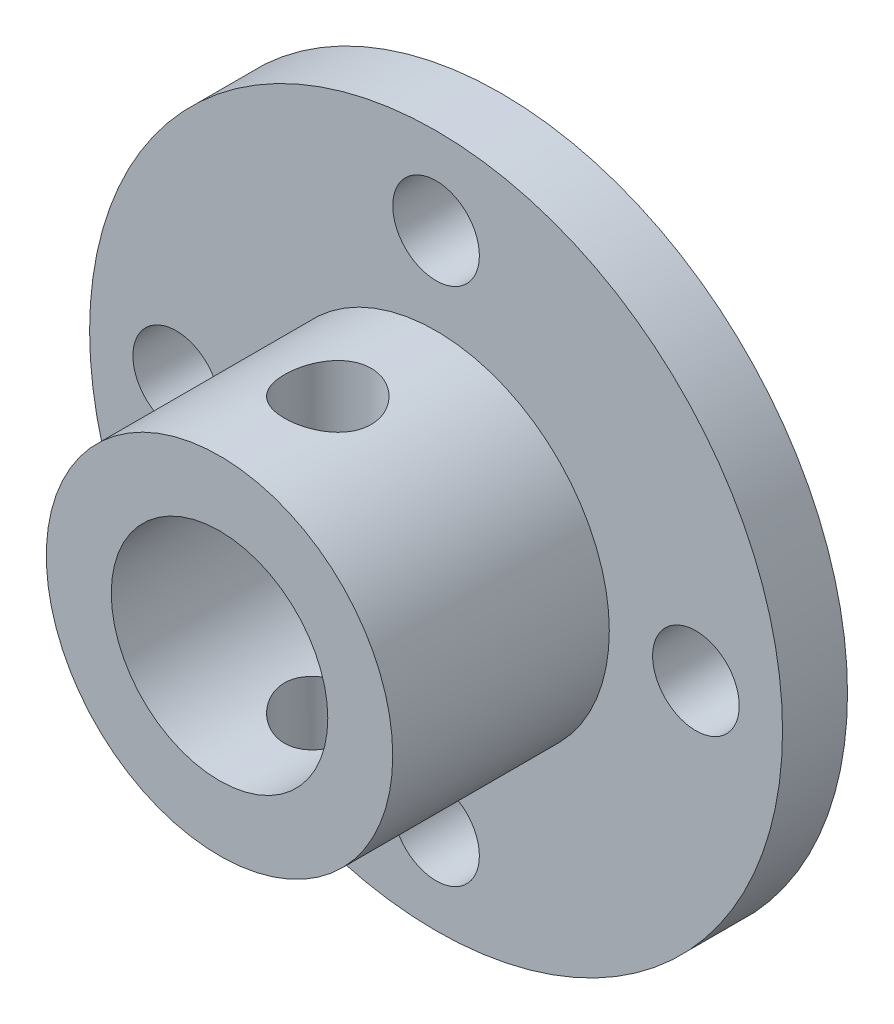
ISO-10303-21;
HEADER;
FILE_DESCRIPTION(('STEP AP214'),'2;1');
FILE_NAME('part.step','',(''),(''),'','','');
FILE_SCHEMA(('AUTOMOTIVE_DESIGN { 1 0 10303 214 1 1 1 1 }'));
ENDSEC;
DATA;
#1=APPLICATION_CONTEXT('core data for automotive mechanical design processes');
#2=APPLICATION_PROTOCOL_DEFINITION('international standard','automotive_design',2000,#1);
#3=PRODUCT_CONTEXT('',#1,'mechanical');
#4=PRODUCT('Part','Part','',(#3));
#5=PRODUCT_RELATED_PRODUCT_CATEGORY('part','',(#4));
#6=PRODUCT_DEFINITION_FORMATION('','',#4);
#7=PRODUCT_DEFINITION_CONTEXT('part definition',#1,'design');
#8=PRODUCT_DEFINITION('design','',#6,#7);
#9=PRODUCT_DEFINITION_SHAPE('','',#8);
#10=(LENGTH_UNIT() NAMED_UNIT(*) SI_UNIT(.MILLI.,.METRE.));
#11=(NAMED_UNIT(*) PLANE_ANGLE_UNIT() SI_UNIT($,.RADIAN.));
#12=(NAMED_UNIT(*) SI_UNIT($,.STERADIAN.) SOLID_ANGLE_UNIT());
#13=UNCERTAINTY_MEASURE_WITH_UNIT(LENGTH_MEASURE(1.E-05),#10,'distance_accuracy_value','');
#14=(GEOMETRIC_REPRESENTATION_CONTEXT(3) GLOBAL_UNCERTAINTY_ASSIGNED_CONTEXT((#13)) GLOBAL_UNIT_ASSIGNED_CONTEXT((#10,
#11,#12)) REPRESENTATION_CONTEXT('',''));
#15=CARTESIAN_POINT('',(0.,0.,0.));
#16=DIRECTION('',(0.,0.,1.));
#17=DIRECTION('',(1.,0.,0.));
#18=AXIS2_PLACEMENT_3D('',#15,#16,#17);
#19=CARTESIAN_POINT('',(0.,0.,3.));
#20=DIRECTION('',(0.,0.,-1.));
#21=DIRECTION('',(-1.,0.,0.));
#22=AXIS2_PLACEMENT_3D('',#19,#20,#21);
#23=CYLINDRICAL_SURFACE('',#22,5.);
#24=CARTESIAN_POINT('',(0.,-5.,6.));
#25=CARTESIAN_POINT('',(0.107493005442892,-4.99999271227084,6.00000985182372));
#26=CARTESIAN_POINT('',(0.215172564090674,-4.99649294306932,6.00871775208838));
#27=CARTESIAN_POINT('',(0.427496480417897,-4.98283453100641,6.04324770352124));
#28=CARTESIAN_POINT('',(0.532131777561249,-4.97265778698877,6.06911627908613));
#29=CARTESIAN_POINT('',(0.734953922727404,-4.94674209213118,6.13687607805883));
#30=CARTESIAN_POINT('',(0.83316066161696,-4.93102136364072,6.17871484621673));
#31=CARTESIAN_POINT('',(1.02107197032837,-4.89556610796078,6.27701917332655));
#32=CARTESIAN_POINT('',(1.11077947675099,-4.87583297458056,6.33347965491893));
#33=CARTESIAN_POINT('',(1.28350100757039,-4.83330886170418,6.46223549856094));
#34=CARTESIAN_POINT('',(1.36606227255021,-4.8104229692919,6.53510665624026));
#35=CARTESIAN_POINT('',(1.51817500478472,-4.76460576906194,6.69340000347678));
#36=CARTESIAN_POINT('',(1.58772010713353,-4.74167444453792,6.77882829721174));
#37=CARTESIAN_POINT('',(1.71487456729288,-4.69722791797136,6.96442807024227));
#38=CARTESIAN_POINT('',(1.77181498119547,-4.67582115964951,7.0650864860232));
#39=CARTESIAN_POINT('',(1.86775471903715,-4.63833647186792,7.27553639842004));
#40=CARTESIAN_POINT('',(1.90676256428584,-4.62225601244175,7.38532352784836));
#41=CARTESIAN_POINT('',(1.96389882339587,-4.59826357660818,7.6057123335921));
#42=CARTESIAN_POINT('',(1.98289396580565,-4.59001420355605,7.71605123557621));
#43=CARTESIAN_POINT('',(2.00217296164003,-4.58164004049144,7.93863499830727));
#44=CARTESIAN_POINT('',(2.00246601631322,-4.58151125522768,8.05087889462501));
#45=CARTESIAN_POINT('',(1.98498936750454,-4.58910500279994,8.26575667145804));
#46=CARTESIAN_POINT('',(1.96847531430514,-4.5962817503845,8.36851571440903));
#47=CARTESIAN_POINT('',(1.91994688029782,-4.61676187607836,8.56965955600671));
#48=CARTESIAN_POINT('',(1.88792979480463,-4.63006632321673,8.66804358811031));
#49=CARTESIAN_POINT('',(1.80869473255107,-4.6615948508853,8.86001783619604));
#50=CARTESIAN_POINT('',(1.76117986231532,-4.67991379280787,8.95346923905469));
#51=CARTESIAN_POINT('',(1.65250646073221,-4.7193811638989,9.13141581636157));
#52=CARTESIAN_POINT('',(1.59134280510084,-4.74053065456848,9.21590760940281));
#53=CARTESIAN_POINT('',(1.45155059945443,-4.7852673674227,9.380409728802));
#54=CARTESIAN_POINT('',(1.37193746297064,-4.80891664976151,9.45956872944602));
#55=CARTESIAN_POINT('',(1.20031442743019,-4.85459824958282,9.60368447800204));
#56=CARTESIAN_POINT('',(1.10830206533443,-4.87663024445324,9.66863839741029));
#57=CARTESIAN_POINT('',(0.912077652605844,-4.91714681264548,9.78361744741583));
#58=CARTESIAN_POINT('',(0.807660491346478,-4.93555270095414,9.83332228119705));
#59=CARTESIAN_POINT('',(0.591023765482883,-4.96614828328758,9.91416786107806));
#60=CARTESIAN_POINT('',(0.478808196849676,-4.97834113462382,9.94531803755741));
#61=CARTESIAN_POINT('',(0.256895887607822,-4.9945613950691,9.9864482954197));
#62=CARTESIAN_POINT('',(0.147443293985536,-4.99902945833514,9.99757245425356));
#63=CARTESIAN_POINT('',(-0.0718453098078155,-5.00068478510631,10.0017131005286));
#64=CARTESIAN_POINT('',(-0.181681213223922,-4.99787393582291,9.99473428154751));
#65=CARTESIAN_POINT('',(-0.393432739121986,-4.98557567063753,9.96370824744801));
#66=CARTESIAN_POINT('',(-0.495482491775473,-4.97639391345523,9.94044201964902));
#67=CARTESIAN_POINT('',(-0.694135428060779,-4.952594414055,9.87856429169019));
#68=CARTESIAN_POINT('',(-0.790737910224843,-4.9379759735653,9.83995082033132));
#69=CARTESIAN_POINT('',(-0.9790787858167,-4.90416594770811,9.74721506032005));
#70=CARTESIAN_POINT('',(-1.0705780227554,-4.88484815979803,9.69265452795685));
#71=CARTESIAN_POINT('',(-1.24344359124655,-4.84373364745524,9.57005967609436));
#72=CARTESIAN_POINT('',(-1.32480584076112,-4.8219359311027,9.50201995707739));
#73=CARTESIAN_POINT('',(-1.48072304302882,-4.77645117638111,9.34912998705038));
#74=CARTESIAN_POINT('',(-1.55447393380606,-4.75273441425052,9.26346645849379));
#75=CARTESIAN_POINT('',(-1.68675119741371,-4.70741672917132,9.08055991699064));
#76=CARTESIAN_POINT('',(-1.74527506133751,-4.68581615526511,8.98331499966005));
#77=CARTESIAN_POINT('',(-1.84580750193163,-4.64714299907708,8.7785383054059));
#78=CARTESIAN_POINT('',(-1.88765059453445,-4.63011630884788,8.67091600078769));
#79=CARTESIAN_POINT('',(-1.9522962197053,-4.60323673477931,8.44926634828485));
#80=CARTESIAN_POINT('',(-1.97511280526931,-4.59337855695998,8.33524379418758));
#81=CARTESIAN_POINT('',(-1.9997156172784,-4.58271759299926,8.11287209822546));
#82=CARTESIAN_POINT('',(-2.00289708230287,-4.58131421008171,8.00470516040665));
#83=CARTESIAN_POINT('',(-1.99180315927752,-4.58614836033098,7.78945514228671));
#84=CARTESIAN_POINT('',(-1.97752998791378,-4.59238492324793,7.68237192609742));
#85=CARTESIAN_POINT('',(-1.93307136615365,-4.6112664907902,7.47666781014496));
#86=CARTESIAN_POINT('',(-1.90353749357098,-4.62364831827449,7.377879725567));
#87=CARTESIAN_POINT('',(-1.83000544849101,-4.65324001232696,7.18662137038652));
#88=CARTESIAN_POINT('',(-1.78600328139381,-4.67045121206006,7.09415285310017));
#89=CARTESIAN_POINT('',(-1.68187276275973,-4.70898609604491,6.91239038072922));
#90=CARTESIAN_POINT('',(-1.62096533515949,-4.73048882313242,6.82358132986952));
#91=CARTESIAN_POINT('',(-1.4858921192715,-4.77463804372237,6.65700668279625));
#92=CARTESIAN_POINT('',(-1.41172233481812,-4.79728488048406,6.57924442787169));
#93=CARTESIAN_POINT('',(-1.24650550627246,-4.84293567087394,6.43179714673639));
#94=CARTESIAN_POINT('',(-1.15467600114614,-4.86586757962185,6.36296269310193));
#95=CARTESIAN_POINT('',(-0.959900320285779,-4.90800406713717,6.24166295737836));
#96=CARTESIAN_POINT('',(-0.856949004547238,-4.92720691092906,6.18920528784747));
#97=CARTESIAN_POINT('',(-0.644738062495204,-4.95939714815861,6.10337778480971));
#98=CARTESIAN_POINT('',(-0.535631618219697,-4.97249363055028,6.06967067643966));
#99=CARTESIAN_POINT('',(-0.312876546281222,-4.99144306209365,6.02136087904573));
#100=CARTESIAN_POINT('',(-0.199243525858914,-4.99731899495637,6.0066975632561));
#101=CARTESIAN_POINT('',(-0.0569122978909297,-4.99975899504136,6.00060461902173));
#102=CARTESIAN_POINT('',(-0.0284626887407579,-5.00000192969175,5.99999739137081));
#103=CARTESIAN_POINT('',(0.,-5.,6.));
#104=B_SPLINE_CURVE_WITH_KNOTS('',3,(#24,#25,#26,#27,#28,#29,#30,#31,#32,#33,#34,#35,#36,#37,
#38,#39,#40,#41,#42,#43,#44,#45,#46,#47,#48,#49,#50,#51,#52,#53,#54,#55,#56,#57,#58,#59,#60,#61,
#62,#63,#64,#65,#66,#67,#68,#69,#70,#71,#72,#73,#74,#75,#76,#77,#78,#79,#80,#81,#82,#83,#84,#85,
#86,#87,#88,#89,#90,#91,#92,#93,#94,#95,#96,#97,#98,#99,#100,#101,#102,#103),.UNSPECIFIED.,.T.,
.F.,(4,2,2,2,2,2,2,2,2,2,2,2,2,2,2,2,2,2,2,2,2,2,2,2,2,2,2,2,2,2,2,2,2,2,2,2,2,2,2,4),(0.,
0.322402987893071,0.645683636007934,0.967911457471581,1.29002753567984,1.62597381700397,
1.96208394934411,2.31315258819217,2.66405423118268,2.99904105308828,3.33386306340488,
3.64538328401372,3.95695787256047,4.27489126298816,4.59294421938183,4.93558349186557,
5.27829092839732,5.62776913162806,5.9770695611379,6.30569184528007,6.63422893570082,
6.94800455564365,7.26182048993796,7.58523513398262,7.90877959498969,8.25368474624413,
8.59864669043748,8.94695045140827,9.29499672645933,9.61799673392747,9.94095572563045,
10.2511431854877,10.5614163580516,10.8894546805669,11.2175920134839,11.5670042353384,
11.9165786364053,12.2596430101332,12.6016125240434,12.686980458968),.UNSPECIFIED.);
#105=CARTESIAN_POINT('',(0.,-5.,6.));
#106=VERTEX_POINT('',#105);
#107=EDGE_CURVE('E75',#106,#106,#104,.T.);
#108=ORIENTED_EDGE('',*,*,#107,.T.);
#109=EDGE_LOOP('',(#108));
#110=FACE_BOUND('',#109,.T.);
#111=CARTESIAN_POINT('',(0.,0.,0.));
#112=DIRECTION('',(0.,0.,1.));
#113=DIRECTION('',(1.,0.,0.));
#114=AXIS2_PLACEMENT_3D('',#111,#112,#113);
#115=CIRCLE('',#114,5.);
#116=CARTESIAN_POINT('',(5.,0.,0.));
#117=VERTEX_POINT('',#116);
#118=EDGE_CURVE('E51',#117,#117,#115,.T.);
#119=ORIENTED_EDGE('',*,*,#118,.F.);
#120=EDGE_LOOP('',(#119));
#121=FACE_BOUND('',#120,.T.);
#122=CARTESIAN_POINT('',(0.,0.,13.));
#123=DIRECTION('',(0.,0.,1.));
#124=DIRECTION('',(1.,0.,0.));
#125=AXIS2_PLACEMENT_3D('',#122,#123,#124);
#126=CIRCLE('',#125,5.);
#127=CARTESIAN_POINT('',(5.,0.,13.));
#128=VERTEX_POINT('',#127);
#129=EDGE_CURVE('E155',#128,#128,#126,.T.);
#130=ORIENTED_EDGE('',*,*,#129,.T.);
#131=EDGE_LOOP('',(#130));
#132=FACE_BOUND('',#131,.T.);
#133=CARTESIAN_POINT('',(0.,5.,6.));
#134=CARTESIAN_POINT('',(-0.10749300544289,4.99999271227084,6.00000985182372));
#135=CARTESIAN_POINT('',(-0.215172564090672,4.99649294306932,6.00871775208838));
#136=CARTESIAN_POINT('',(-0.427496480417895,4.98283453100641,6.04324770352124));
#137=CARTESIAN_POINT('',(-0.532131777561247,4.97265778698877,6.06911627908613));
#138=CARTESIAN_POINT('',(-0.734953922727402,4.94674209213118,6.13687607805883));
#139=CARTESIAN_POINT('',(-0.833160661616958,4.93102136364072,6.17871484621673));
#140=CARTESIAN_POINT('',(-1.02107197032837,4.89556610796078,6.27701917332655));
#141=CARTESIAN_POINT('',(-1.11077947675099,4.87583297458057,6.33347965491893));
#142=CARTESIAN_POINT('',(-1.28350100757039,4.83330886170419,6.46223549856094));
#143=CARTESIAN_POINT('',(-1.36606227255021,4.8104229692919,6.53510665624026));
#144=CARTESIAN_POINT('',(-1.51817500478472,4.76460576906194,6.69340000347678));
#145=CARTESIAN_POINT('',(-1.58772010713353,4.74167444453792,6.77882829721174));
#146=CARTESIAN_POINT('',(-1.71487456729288,4.69722791797136,6.96442807024227));
#147=CARTESIAN_POINT('',(-1.77181498119547,4.67582115964951,7.0650864860232));
#148=CARTESIAN_POINT('',(-1.86775471903715,4.63833647186792,7.27553639842004));
#149=CARTESIAN_POINT('',(-1.90676256428583,4.62225601244176,7.38532352784836));
#150=CARTESIAN_POINT('',(-1.96389882339587,4.59826357660818,7.6057123335921));
#151=CARTESIAN_POINT('',(-1.98289396580565,4.59001420355605,7.71605123557621));
#152=CARTESIAN_POINT('',(-2.00217296164003,4.58164004049144,7.93863499830727));
#153=CARTESIAN_POINT('',(-2.00246601631322,4.58151125522768,8.05087889462501));
#154=CARTESIAN_POINT('',(-1.98498936750454,4.58910500279994,8.26575667145804));
#155=CARTESIAN_POINT('',(-1.96847531430514,4.5962817503845,8.36851571440903));
#156=CARTESIAN_POINT('',(-1.91994688029782,4.61676187607836,8.56965955600671));
#157=CARTESIAN_POINT('',(-1.88792979480463,4.63006632321673,8.66804358811031));
#158=CARTESIAN_POINT('',(-1.80869473255107,4.6615948508853,8.86001783619604));
#159=CARTESIAN_POINT('',(-1.76117986231532,4.67991379280787,8.95346923905469));
#160=CARTESIAN_POINT('',(-1.65250646073221,4.7193811638989,9.13141581636157));
#161=CARTESIAN_POINT('',(-1.59134280510084,4.74053065456848,9.21590760940281));
#162=CARTESIAN_POINT('',(-1.45155059945443,4.7852673674227,9.380409728802));
#163=CARTESIAN_POINT('',(-1.37193746297063,4.80891664976151,9.45956872944602));
#164=CARTESIAN_POINT('',(-1.20031442743019,4.85459824958282,9.60368447800204));
#165=CARTESIAN_POINT('',(-1.10830206533443,4.87663024445324,9.66863839741029));
#166=CARTESIAN_POINT('',(-0.912077652605842,4.91714681264548,9.78361744741583));
#167=CARTESIAN_POINT('',(-0.807660491346477,4.93555270095414,9.83332228119705));
#168=CARTESIAN_POINT('',(-0.591023765482882,4.96614828328759,9.91416786107806));
#169=CARTESIAN_POINT('',(-0.478808196849674,4.97834113462382,9.94531803755741));
#170=CARTESIAN_POINT('',(-0.25689588760782,4.9945613950691,9.9864482954197));
#171=CARTESIAN_POINT('',(-0.147443293985535,4.99902945833514,9.99757245425356));
#172=CARTESIAN_POINT('',(0.0718453098078173,5.00068478510631,10.0017131005286));
#173=CARTESIAN_POINT('',(0.181681213223924,4.99787393582291,9.99473428154751));
#174=CARTESIAN_POINT('',(0.393432739121988,4.98557567063753,9.96370824744801));
#175=CARTESIAN_POINT('',(0.495482491775476,4.97639391345523,9.94044201964902));
#176=CARTESIAN_POINT('',(0.694135428060782,4.952594414055,9.87856429169019));
#177=CARTESIAN_POINT('',(0.790737910224846,4.9379759735653,9.83995082033132));
#178=CARTESIAN_POINT('',(0.979078785816703,4.90416594770811,9.74721506032005));
#179=CARTESIAN_POINT('',(1.07057802275541,4.88484815979803,9.69265452795685));
#180=CARTESIAN_POINT('',(1.24344359124656,4.84373364745524,9.57005967609436));
#181=CARTESIAN_POINT('',(1.32480584076113,4.8219359311027,9.50201995707739));
#182=CARTESIAN_POINT('',(1.48072304302882,4.77645117638112,9.34912998705038));
#183=CARTESIAN_POINT('',(1.55447393380606,4.75273441425052,9.26346645849379));
#184=CARTESIAN_POINT('',(1.68675119741371,4.70741672917132,9.08055991699064));
#185=CARTESIAN_POINT('',(1.74527506133751,4.6858161552651,8.98331499966005));
#186=CARTESIAN_POINT('',(1.84580750193163,4.64714299907708,8.7785383054059));
#187=CARTESIAN_POINT('',(1.88765059453445,4.63011630884787,8.67091600078769));
#188=CARTESIAN_POINT('',(1.9522962197053,4.60323673477931,8.44926634828485));
#189=CARTESIAN_POINT('',(1.97511280526932,4.59337855695998,8.33524379418758));
#190=CARTESIAN_POINT('',(1.9997156172784,4.58271759299926,8.11287209822546));
#191=CARTESIAN_POINT('',(2.00289708230287,4.58131421008171,8.00470516040665));
#192=CARTESIAN_POINT('',(1.99180315927753,4.58614836033098,7.78945514228671));
#193=CARTESIAN_POINT('',(1.97752998791378,4.59238492324793,7.68237192609742));
#194=CARTESIAN_POINT('',(1.93307136615365,4.6112664907902,7.47666781014496));
#195=CARTESIAN_POINT('',(1.90353749357098,4.62364831827449,7.377879725567));
#196=CARTESIAN_POINT('',(1.83000544849101,4.65324001232696,7.18662137038652));
#197=CARTESIAN_POINT('',(1.78600328139381,4.67045121206006,7.09415285310017));
#198=CARTESIAN_POINT('',(1.68187276275973,4.70898609604491,6.91239038072922));
#199=CARTESIAN_POINT('',(1.62096533515949,4.73048882313242,6.82358132986952));
#200=CARTESIAN_POINT('',(1.4858921192715,4.77463804372237,6.65700668279625));
#201=CARTESIAN_POINT('',(1.41172233481812,4.79728488048406,6.57924442787169));
#202=CARTESIAN_POINT('',(1.24650550627246,4.84293567087394,6.43179714673639));
#203=CARTESIAN_POINT('',(1.15467600114614,4.86586757962185,6.36296269310193));
#204=CARTESIAN_POINT('',(0.959900320285781,4.90800406713716,6.24166295737836));
#205=CARTESIAN_POINT('',(0.85694900454724,4.92720691092906,6.18920528784747));
#206=CARTESIAN_POINT('',(0.644738062495205,4.95939714815861,6.10337778480971));
#207=CARTESIAN_POINT('',(0.535631618219698,4.97249363055028,6.06967067643966));
#208=CARTESIAN_POINT('',(0.312876546281222,4.99144306209365,6.02136087904573));
#209=CARTESIAN_POINT('',(0.199243525858914,4.99731899495637,6.0066975632561));
#210=CARTESIAN_POINT('',(0.056912297890931,4.99975899504136,6.00060461902173));
#211=CARTESIAN_POINT('',(0.0284626887407595,5.00000192969175,5.99999739137081));
#212=CARTESIAN_POINT('',(0.,5.,6.));
#213=B_SPLINE_CURVE_WITH_KNOTS('',3,(#133,#134,#135,#136,#137,#138,#139,#140,#141,#142,#143,
#144,#145,#146,#147,#148,#149,#150,#151,#152,#153,#154,#155,#156,#157,#158,#159,#160,#161,#162,
#163,#164,#165,#166,#167,#168,#169,#170,#171,#172,#173,#174,#175,#176,#177,#178,#179,#180,#181,
#182,#183,#184,#185,#186,#187,#188,#189,#190,#191,#192,#193,#194,#195,#196,#197,#198,#199,#200,
#201,#202,#203,#204,#205,#206,#207,#208,#209,#210,#211,#212),.UNSPECIFIED.,.T.,.F.,(4,2,2,2,2,2,
2,2,2,2,2,2,2,2,2,2,2,2,2,2,2,2,2,2,2,2,2,2,2,2,2,2,2,2,2,2,2,2,2,4),(0.,0.322402987893071,
0.645683636007934,0.967911457471581,1.29002753567984,1.62597381700397,1.96208394934411,
2.31315258819217,2.66405423118268,2.99904105308829,3.33386306340488,3.64538328401372,
3.95695787256047,4.27489126298816,4.59294421938183,4.93558349186557,5.27829092839733,
5.62776913162806,5.9770695611379,6.30569184528007,6.63422893570082,6.94800455564366,
7.26182048993797,7.58523513398263,7.90877959498969,8.25368474624413,8.59864669043748,
8.94695045140827,9.29499672645933,9.61799673392748,9.94095572563045,10.2511431854877,
10.5614163580516,10.8894546805669,11.2175920134839,11.5670042353384,11.9165786364053,
12.2596430101332,12.6016125240434,12.686980458968),.UNSPECIFIED.);
#214=CARTESIAN_POINT('',(0.,5.,6.));
#215=VERTEX_POINT('',#214);
#216=EDGE_CURVE('E81',#215,#215,#213,.T.);
#217=ORIENTED_EDGE('',*,*,#216,.T.);
#218=EDGE_LOOP('',(#217));
#219=FACE_BOUND('',#218,.T.);
#220=ADVANCED_FACE('F33',(#110,#121,#132,#219),#23,.F.);
#221=CARTESIAN_POINT('',(0.,0.,13.));
#222=DIRECTION('',(0.,0.,-1.));
#223=DIRECTION('',(-1.,0.,0.));
#224=AXIS2_PLACEMENT_3D('',#221,#222,#223);
#225=CYLINDRICAL_SURFACE('',#224,8.);
#226=CARTESIAN_POINT('',(0.,0.,13.));
#227=DIRECTION('',(0.,0.,1.));
#228=DIRECTION('',(1.,0.,0.));
#229=AXIS2_PLACEMENT_3D('',#226,#227,#228);
#230=CIRCLE('',#229,8.);
#231=CARTESIAN_POINT('',(8.,0.,13.));
#232=VERTEX_POINT('',#231);
#233=EDGE_CURVE('E126',#232,#232,#230,.T.);
#234=ORIENTED_EDGE('',*,*,#233,.F.);
#235=EDGE_LOOP('',(#234));
#236=FACE_BOUND('',#235,.T.);
#237=CARTESIAN_POINT('',(0.,0.,3.));
#238=DIRECTION('',(0.,0.,1.));
#239=DIRECTION('',(1.,0.,0.));
#240=AXIS2_PLACEMENT_3D('',#237,#238,#239);
#241=CIRCLE('',#240,8.);
#242=CARTESIAN_POINT('',(8.,0.,3.));
#243=VERTEX_POINT('',#242);
#244=EDGE_CURVE('E131',#243,#243,#241,.T.);
#245=ORIENTED_EDGE('',*,*,#244,.T.);
#246=EDGE_LOOP('',(#245));
#247=FACE_BOUND('',#246,.T.);
#248=CARTESIAN_POINT('',(0.,-8.,6.));
#249=CARTESIAN_POINT('',(0.110501451559642,-7.9999981315735,6.00000310098421));
#250=CARTESIAN_POINT('',(0.221037543774352,-7.99768770842435,6.00918873436505));
#251=CARTESIAN_POINT('',(0.438941765027378,-7.98869485106526,6.04563353507601));
#252=CARTESIAN_POINT('',(0.54630806249432,-7.98200993893301,6.07290294605047));
#253=CARTESIAN_POINT('',(0.754694496243436,-7.96500835109376,6.14458567128278));
#254=CARTESIAN_POINT('',(0.855722084573337,-7.95469603789411,6.18897839828703));
#255=CARTESIAN_POINT('',(1.04889617587257,-7.93153791743495,6.29357518672646));
#256=CARTESIAN_POINT('',(1.14104237913168,-7.91869202472209,6.35377978149196));
#257=CARTESIAN_POINT('',(1.31573590306789,-7.89156551455591,6.48960105287224));
#258=CARTESIAN_POINT('',(1.39807425341474,-7.87726276197502,6.56548209994541));
#259=CARTESIAN_POINT('',(1.54899856960443,-7.84898160157248,6.72993627321205));
#260=CARTESIAN_POINT('',(1.61758298259892,-7.83500323053157,6.81851083059591));
#261=CARTESIAN_POINT('',(1.74003539039863,-7.80873034264225,7.00746030231599));
#262=CARTESIAN_POINT('',(1.79366962123352,-7.79646392619748,7.10799097441164));
#263=CARTESIAN_POINT('',(1.88319587806766,-7.77532659757355,7.31699788221338));
#264=CARTESIAN_POINT('',(1.91909074058686,-7.76645514259225,7.42547284444269));
#265=CARTESIAN_POINT('',(1.97140644907302,-7.7533396892843,7.64499133093555));
#266=CARTESIAN_POINT('',(1.98820302444274,-7.74900654662681,7.75593986138399));
#267=CARTESIAN_POINT('',(2.00301570008855,-7.74519149946122,7.97915809199913));
#268=CARTESIAN_POINT('',(2.00103485575748,-7.74570880570571,8.09142757425618));
#269=CARTESIAN_POINT('',(1.97864869951961,-7.75145607355756,8.3112210769938));
#270=CARTESIAN_POINT('',(1.95869112025418,-7.75657150676391,8.41879416195377));
#271=CARTESIAN_POINT('',(1.90163224920399,-7.77075612894758,8.62901473454808));
#272=CARTESIAN_POINT('',(1.86452973609252,-7.77982559958985,8.73166187070523));
#273=CARTESIAN_POINT('',(1.77385263724958,-7.80100151874212,8.93031735500284));
#274=CARTESIAN_POINT('',(1.72011555631056,-7.81313769959755,9.02624822905276));
#275=CARTESIAN_POINT('',(1.59780836801993,-7.83906281127988,9.20789161300909));
#276=CARTESIAN_POINT('',(1.52923566507845,-7.85285203112837,9.29360233075634));
#277=CARTESIAN_POINT('',(1.37688456624163,-7.88101174053188,9.4549381542592));
#278=CARTESIAN_POINT('',(1.29272834422115,-7.89538759304001,9.53020598674847));
#279=CARTESIAN_POINT('',(1.11281589000493,-7.92274620771675,9.6656283232852));
#280=CARTESIAN_POINT('',(1.01705930361059,-7.93572892732543,9.72578236568475));
#281=CARTESIAN_POINT('',(0.816154518241857,-7.9589030945892,9.82940078163251));
#282=CARTESIAN_POINT('',(0.710975190944832,-7.96908480170303,9.87280712033924));
#283=CARTESIAN_POINT('',(0.494501344190511,-7.98543889321888,9.94122307427943));
#284=CARTESIAN_POINT('',(0.383207998867314,-7.99161204452374,9.96623620855752));
#285=CARTESIAN_POINT('',(0.160719960520037,-7.999139990285,9.99661008741178));
#286=CARTESIAN_POINT('',(0.049595626650947,-8.00061404677705,10.0024573681004));
#287=CARTESIAN_POINT('',(-0.172043833068677,-7.99891739752601,9.99566799725935));
#288=CARTESIAN_POINT('',(-0.282559012859459,-7.99574710989128,9.98303300960116));
#289=CARTESIAN_POINT('',(-0.498152358368655,-7.98519441503143,9.94003878881149));
#290=CARTESIAN_POINT('',(-0.603286825291672,-7.97787512247748,9.90994498203068));
#291=CARTESIAN_POINT('',(-0.807009723270014,-7.95984942178845,9.83319055462874));
#292=CARTESIAN_POINT('',(-0.905597492043511,-7.94914267159856,9.78652826091577));
#293=CARTESIAN_POINT('',(-1.0953641792398,-7.92524410568414,9.6770184948337));
#294=CARTESIAN_POINT('',(-1.18638058911444,-7.91201156489243,9.61389851680432));
#295=CARTESIAN_POINT('',(-1.35670215152433,-7.88459345583226,9.47361345493737));
#296=CARTESIAN_POINT('',(-1.43600527863068,-7.87040772335606,9.39644594717746));
#297=CARTESIAN_POINT('',(-1.58265409076364,-7.84225275947695,9.22799738554071));
#298=CARTESIAN_POINT('',(-1.64965849016271,-7.82829738916375,9.13641639599677));
#299=CARTESIAN_POINT('',(-1.7673476786836,-7.80257171169652,8.94302315404571));
#300=CARTESIAN_POINT('',(-1.81803319221058,-7.79080130756035,8.84121135605366));
#301=CARTESIAN_POINT('',(-1.90126856081239,-7.77090792979554,8.6307923701159));
#302=CARTESIAN_POINT('',(-1.93392586220542,-7.76276340389207,8.52222982887465));
#303=CARTESIAN_POINT('',(-1.98046087993837,-7.75102325453578,8.30092048281452));
#304=CARTESIAN_POINT('',(-1.99434270330488,-7.74742663626581,8.18817459862335));
#305=CARTESIAN_POINT('',(-2.00271812044532,-7.74526534938609,7.96517196819306));
#306=CARTESIAN_POINT('',(-1.99775719704016,-7.74655910304352,7.85493675316703));
#307=CARTESIAN_POINT('',(-1.96983637108382,-7.7537054534379,7.63692814844269));
#308=CARTESIAN_POINT('',(-1.94687683024902,-7.75955795855809,7.52915470931513));
#309=CARTESIAN_POINT('',(-1.88390842592372,-7.77508347576963,7.31972205457946));
#310=CARTESIAN_POINT('',(-1.84400187290717,-7.78473353648412,7.21803025967972));
#311=CARTESIAN_POINT('',(-1.74835321814009,-7.80677007633105,7.02271282304842));
#312=CARTESIAN_POINT('',(-1.69260892004558,-7.81915693494364,6.92908830241745));
#313=CARTESIAN_POINT('',(-1.56515699818285,-7.8456751235135,6.74992716133064));
#314=CARTESIAN_POINT('',(-1.49307088388301,-7.85984353109009,6.66466523543472));
#315=CARTESIAN_POINT('',(-1.33571916158631,-7.88810702995048,6.50727060693946));
#316=CARTESIAN_POINT('',(-1.25045042834819,-7.90220210302746,6.43514102651604));
#317=CARTESIAN_POINT('',(-1.06729011560345,-7.92903540863551,6.30478492191386));
#318=CARTESIAN_POINT('',(-0.969197896421848,-7.94174444487824,6.24683384843789));
#319=CARTESIAN_POINT('',(-0.764354746013968,-7.96406566633491,6.14833671607929));
#320=CARTESIAN_POINT('',(-0.657610084582319,-7.97368006933042,6.10777818580195));
#321=CARTESIAN_POINT('',(-0.459213670991295,-7.98730746087389,6.05123755956046));
#322=CARTESIAN_POINT('',(-0.368506894544091,-7.9920344673692,6.03206500926209));
#323=CARTESIAN_POINT('',(-0.185208095381711,-7.99838140309264,6.00644540850408));
#324=CARTESIAN_POINT('',(-0.0926162149901543,-8.00000156601192,5.99999740092627));
#325=CARTESIAN_POINT('',(0.,-8.,6.));
#326=B_SPLINE_CURVE_WITH_KNOTS('',3,(#248,#249,#250,#251,#252,#253,#254,#255,#256,#257,#258,
#259,#260,#261,#262,#263,#264,#265,#266,#267,#268,#269,#270,#271,#272,#273,#274,#275,#276,#277,
#278,#279,#280,#281,#282,#283,#284,#285,#286,#287,#288,#289,#290,#291,#292,#293,#294,#295,#296,
#297,#298,#299,#300,#301,#302,#303,#304,#305,#306,#307,#308,#309,#310,#311,#312,#313,#314,#315,
#316,#317,#318,#319,#320,#321,#322,#323,#324,#325),.UNSPECIFIED.,.T.,.F.,(4,2,2,2,2,2,2,2,2,2,2,
2,2,2,2,2,2,2,2,2,2,2,2,2,2,2,2,2,2,2,2,2,2,2,2,2,2,2,4),(0.,0.33116494996252,0.662517650351866,
0.99347320304814,1.32443992022577,1.66152580582852,1.99864972773416,2.34078196727742,
2.68285948225824,3.01808393468093,3.3532538415469,3.68029996013785,4.00736937959145,
4.337740371696,4.66816921119311,5.00802001296453,5.34788119415424,5.6889097201658,
6.02987298255951,6.36211078603463,6.69431868154751,7.02160366023144,7.34892169767481,
7.68204783424897,8.01523150681786,8.35659345610395,8.69794025003771,9.03723006156476,
9.37644564340971,9.70591707202577,10.0353818794581,10.3628853408369,10.6904342418696,
11.0265276855097,11.3627009303165,11.7049624733721,12.0469781843289,12.3245632392729,
12.6021274139515),.UNSPECIFIED.);
#327=CARTESIAN_POINT('',(0.,-8.,6.));
#328=VERTEX_POINT('',#327);
#329=EDGE_CURVE('E55',#328,#328,#326,.T.);
#330=ORIENTED_EDGE('',*,*,#329,.F.);
#331=EDGE_LOOP('',(#330));
#332=FACE_BOUND('',#331,.T.);
#333=CARTESIAN_POINT('',(0.,8.,6.));
#334=CARTESIAN_POINT('',(-0.11050145155964,7.9999981315735,6.00000310098421));
#335=CARTESIAN_POINT('',(-0.22103754377435,7.99768770842435,6.00918873436505));
#336=CARTESIAN_POINT('',(-0.438941765027376,7.98869485106526,6.04563353507601));
#337=CARTESIAN_POINT('',(-0.546308062494318,7.98200993893301,6.07290294605047));
#338=CARTESIAN_POINT('',(-0.754694496243434,7.96500835109376,6.14458567128278));
#339=CARTESIAN_POINT('',(-0.855722084573335,7.95469603789411,6.18897839828703));
#340=CARTESIAN_POINT('',(-1.04889617587257,7.93153791743495,6.29357518672646));
#341=CARTESIAN_POINT('',(-1.14104237913168,7.91869202472209,6.35377978149196));
#342=CARTESIAN_POINT('',(-1.31573590306789,7.89156551455591,6.48960105287224));
#343=CARTESIAN_POINT('',(-1.39807425341474,7.87726276197502,6.56548209994541));
#344=CARTESIAN_POINT('',(-1.54899856960442,7.84898160157248,6.72993627321205));
#345=CARTESIAN_POINT('',(-1.61758298259892,7.83500323053157,6.81851083059591));
#346=CARTESIAN_POINT('',(-1.74003539039863,7.80873034264225,7.00746030231599));
#347=CARTESIAN_POINT('',(-1.79366962123352,7.79646392619748,7.10799097441164));
#348=CARTESIAN_POINT('',(-1.88319587806766,7.77532659757355,7.31699788221338));
#349=CARTESIAN_POINT('',(-1.91909074058685,7.76645514259225,7.42547284444269));
#350=CARTESIAN_POINT('',(-1.97140644907302,7.7533396892843,7.64499133093555));
#351=CARTESIAN_POINT('',(-1.98820302444274,7.74900654662681,7.75593986138399));
#352=CARTESIAN_POINT('',(-2.00301570008854,7.74519149946122,7.97915809199913));
#353=CARTESIAN_POINT('',(-2.00103485575748,7.74570880570571,8.09142757425618));
#354=CARTESIAN_POINT('',(-1.97864869951961,7.75145607355756,8.3112210769938));
#355=CARTESIAN_POINT('',(-1.95869112025418,7.75657150676391,8.41879416195377));
#356=CARTESIAN_POINT('',(-1.90163224920399,7.77075612894758,8.62901473454808));
#357=CARTESIAN_POINT('',(-1.86452973609252,7.77982559958985,8.73166187070523));
#358=CARTESIAN_POINT('',(-1.77385263724958,7.80100151874212,8.93031735500284));
#359=CARTESIAN_POINT('',(-1.72011555631056,7.81313769959755,9.02624822905276));
#360=CARTESIAN_POINT('',(-1.59780836801993,7.83906281127988,9.20789161300909));
#361=CARTESIAN_POINT('',(-1.52923566507845,7.85285203112837,9.29360233075633));
#362=CARTESIAN_POINT('',(-1.37688456624163,7.88101174053188,9.4549381542592));
#363=CARTESIAN_POINT('',(-1.29272834422115,7.89538759304001,9.53020598674847));
#364=CARTESIAN_POINT('',(-1.11281589000493,7.92274620771675,9.6656283232852));
#365=CARTESIAN_POINT('',(-1.01705930361059,7.93572892732543,9.72578236568475));
#366=CARTESIAN_POINT('',(-0.816154518241855,7.9589030945892,9.82940078163251));
#367=CARTESIAN_POINT('',(-0.710975190944831,7.96908480170303,9.87280712033924));
#368=CARTESIAN_POINT('',(-0.49450134419051,7.98543889321888,9.94122307427943));
#369=CARTESIAN_POINT('',(-0.383207998867312,7.99161204452374,9.96623620855752));
#370=CARTESIAN_POINT('',(-0.160719960520035,7.999139990285,9.99661008741178));
#371=CARTESIAN_POINT('',(-0.0495956266509454,8.00061404677705,10.0024573681004));
#372=CARTESIAN_POINT('',(0.172043833068678,7.99891739752601,9.99566799725935));
#373=CARTESIAN_POINT('',(0.282559012859461,7.99574710989128,9.98303300960116));
#374=CARTESIAN_POINT('',(0.498152358368657,7.98519441503143,9.94003878881149));
#375=CARTESIAN_POINT('',(0.603286825291674,7.97787512247748,9.90994498203068));
#376=CARTESIAN_POINT('',(0.807009723270016,7.95984942178845,9.83319055462874));
#377=CARTESIAN_POINT('',(0.905597492043514,7.94914267159856,9.78652826091577));
#378=CARTESIAN_POINT('',(1.0953641792398,7.92524410568414,9.6770184948337));
#379=CARTESIAN_POINT('',(1.18638058911444,7.91201156489243,9.61389851680432));
#380=CARTESIAN_POINT('',(1.35670215152433,7.88459345583226,9.47361345493737));
#381=CARTESIAN_POINT('',(1.43600527863068,7.87040772335606,9.39644594717746));
#382=CARTESIAN_POINT('',(1.58265409076364,7.84225275947695,9.22799738554071));
#383=CARTESIAN_POINT('',(1.64965849016271,7.82829738916375,9.13641639599677));
#384=CARTESIAN_POINT('',(1.7673476786836,7.80257171169652,8.94302315404571));
#385=CARTESIAN_POINT('',(1.81803319221058,7.79080130756035,8.84121135605366));
#386=CARTESIAN_POINT('',(1.90126856081239,7.77090792979553,8.6307923701159));
#387=CARTESIAN_POINT('',(1.93392586220542,7.76276340389207,8.52222982887465));
#388=CARTESIAN_POINT('',(1.98046087993837,7.75102325453578,8.30092048281452));
#389=CARTESIAN_POINT('',(1.99434270330488,7.74742663626581,8.18817459862335));
#390=CARTESIAN_POINT('',(2.00271812044533,7.74526534938609,7.96517196819306));
#391=CARTESIAN_POINT('',(1.99775719704016,7.74655910304351,7.85493675316703));
#392=CARTESIAN_POINT('',(1.96983637108382,7.7537054534379,7.63692814844269));
#393=CARTESIAN_POINT('',(1.94687683024903,7.75955795855809,7.52915470931513));
#394=CARTESIAN_POINT('',(1.88390842592373,7.77508347576963,7.31972205457946));
#395=CARTESIAN_POINT('',(1.84400187290717,7.78473353648412,7.21803025967972));
#396=CARTESIAN_POINT('',(1.74835321814009,7.80677007633105,7.02271282304841));
#397=CARTESIAN_POINT('',(1.69260892004559,7.81915693494364,6.92908830241745));
#398=CARTESIAN_POINT('',(1.56515699818285,7.84567512351349,6.74992716133064));
#399=CARTESIAN_POINT('',(1.49307088388301,7.85984353109009,6.66466523543472));
#400=CARTESIAN_POINT('',(1.33571916158632,7.88810702995047,6.50727060693946));
#401=CARTESIAN_POINT('',(1.2504504283482,7.90220210302746,6.43514102651604));
#402=CARTESIAN_POINT('',(1.06729011560345,7.9290354086355,6.30478492191386));
#403=CARTESIAN_POINT('',(0.96919789642185,7.94174444487824,6.24683384843789));
#404=CARTESIAN_POINT('',(0.764354746013969,7.96406566633491,6.14833671607929));
#405=CARTESIAN_POINT('',(0.657610084582321,7.97368006933042,6.10777818580195));
#406=CARTESIAN_POINT('',(0.459213670991297,7.98730746087389,6.05123755956046));
#407=CARTESIAN_POINT('',(0.368506894544092,7.9920344673692,6.03206500926209));
#408=CARTESIAN_POINT('',(0.185208095381711,7.99838140309264,6.00644540850408));
#409=CARTESIAN_POINT('',(0.0926162149901558,8.00000156601192,5.99999740092627));
#410=CARTESIAN_POINT('',(0.,8.,6.));
#411=B_SPLINE_CURVE_WITH_KNOTS('',3,(#333,#334,#335,#336,#337,#338,#339,#340,#341,#342,#343,
#344,#345,#346,#347,#348,#349,#350,#351,#352,#353,#354,#355,#356,#357,#358,#359,#360,#361,#362,
#363,#364,#365,#366,#367,#368,#369,#370,#371,#372,#373,#374,#375,#376,#377,#378,#379,#380,#381,
#382,#383,#384,#385,#386,#387,#388,#389,#390,#391,#392,#393,#394,#395,#396,#397,#398,#399,#400,
#401,#402,#403,#404,#405,#406,#407,#408,#409,#410),.UNSPECIFIED.,.T.,.F.,(4,2,2,2,2,2,2,2,2,2,2,
2,2,2,2,2,2,2,2,2,2,2,2,2,2,2,2,2,2,2,2,2,2,2,2,2,2,2,4),(0.,0.331164949962519,
0.662517650351866,0.99347320304814,1.32443992022577,1.66152580582852,1.99864972773416,
2.34078196727742,2.68285948225824,3.01808393468093,3.3532538415469,3.68029996013785,
4.00736937959145,4.337740371696,4.66816921119311,5.00802001296453,5.34788119415424,
5.68890972016579,6.02987298255951,6.36211078603462,6.69431868154751,7.02160366023144,
7.34892169767481,7.68204783424897,8.01523150681786,8.35659345610395,8.69794025003771,
9.03723006156476,9.37644564340971,9.70591707202577,10.0353818794581,10.3628853408369,
10.6904342418696,11.0265276855097,11.3627009303165,11.7049624733721,12.0469781843289,
12.3245632392729,12.6021274139515),.UNSPECIFIED.);
#412=CARTESIAN_POINT('',(0.,8.,6.));
#413=VERTEX_POINT('',#412);
#414=EDGE_CURVE('E37',#413,#413,#411,.T.);
#415=ORIENTED_EDGE('',*,*,#414,.F.);
#416=EDGE_LOOP('',(#415));
#417=FACE_BOUND('',#416,.T.);
#418=ADVANCED_FACE('F60',(#236,#247,#332,#417),#225,.T.);
#419=CARTESIAN_POINT('',(0.,0.,3.));
#420=DIRECTION('',(0.,0.,1.));
#421=DIRECTION('',(1.,0.,0.));
#422=AXIS2_PLACEMENT_3D('',#419,#420,#421);
#423=PLANE('',#422);
#424=CARTESIAN_POINT('',(12.,-1.25693328198353E-13,3.));
#425=DIRECTION('',(0.,0.,1.));
#426=DIRECTION('',(1.,0.,0.));
#427=AXIS2_PLACEMENT_3D('',#424,#425,#426);
#428=CIRCLE('',#427,2.);
#429=CARTESIAN_POINT('',(14.,-1.25693328198353E-13,3.));
#430=VERTEX_POINT('',#429);
#431=EDGE_CURVE('E125',#430,#430,#428,.T.);
#432=ORIENTED_EDGE('',*,*,#431,.F.);
#433=EDGE_LOOP('',(#432));
#434=FACE_BOUND('',#433,.T.);
#435=CARTESIAN_POINT('',(-12.,0.,3.));
#436=DIRECTION('',(0.,0.,1.));
#437=DIRECTION('',(1.,0.,0.));
#438=AXIS2_PLACEMENT_3D('',#435,#436,#437);
#439=CIRCLE('',#438,2.);
#440=CARTESIAN_POINT('',(-10.,0.,3.));
#441=VERTEX_POINT('',#440);
#442=EDGE_CURVE('E139',#441,#441,#439,.T.);
#443=ORIENTED_EDGE('',*,*,#442,.F.);
#444=EDGE_LOOP('',(#443));
#445=FACE_BOUND('',#444,.T.);
#446=CARTESIAN_POINT('',(0.,0.,3.));
#447=DIRECTION('',(0.,0.,1.));
#448=DIRECTION('',(1.,0.,0.));
#449=AXIS2_PLACEMENT_3D('',#446,#447,#448);
#450=CIRCLE('',#449,16.);
#451=CARTESIAN_POINT('',(16.,0.,3.));
#452=VERTEX_POINT('',#451);
#453=EDGE_CURVE('E10',#452,#452,#450,.T.);
#454=ORIENTED_EDGE('',*,*,#453,.T.);
#455=EDGE_LOOP('',(#454));
#456=FACE_BOUND('',#455,.T.);
#457=CARTESIAN_POINT('',(0.,-12.,3.));
#458=DIRECTION('',(0.,0.,1.));
#459=DIRECTION('',(1.,0.,0.));
#460=AXIS2_PLACEMENT_3D('',#457,#458,#459);
#461=CIRCLE('',#460,2.);
#462=CARTESIAN_POINT('',(2.,-12.,3.));
#463=VERTEX_POINT('',#462);
#464=EDGE_CURVE('E143',#463,#463,#461,.T.);
#465=ORIENTED_EDGE('',*,*,#464,.F.);
#466=EDGE_LOOP('',(#465));
#467=FACE_BOUND('',#466,.T.);
#468=CARTESIAN_POINT('',(0.,12.,3.));
#469=DIRECTION('',(0.,0.,1.));
#470=DIRECTION('',(1.,0.,0.));
#471=AXIS2_PLACEMENT_3D('',#468,#469,#470);
#472=CIRCLE('',#471,2.);
#473=CARTESIAN_POINT('',(2.00000000000008,12.,3.));
#474=VERTEX_POINT('',#473);
#475=EDGE_CURVE('E135',#474,#474,#472,.T.);
#476=ORIENTED_EDGE('',*,*,#475,.F.);
#477=EDGE_LOOP('',(#476));
#478=FACE_BOUND('',#477,.T.);
#479=ORIENTED_EDGE('',*,*,#244,.F.);
#480=EDGE_LOOP('',(#479));
#481=FACE_BOUND('',#480,.T.);
#482=ADVANCED_FACE('F93',(#434,#445,#456,#467,#478,#481),#423,.T.);
#483=CARTESIAN_POINT('',(0.,0.,0.));
#484=DIRECTION('',(0.,0.,1.));
#485=DIRECTION('',(1.,0.,0.));
#486=AXIS2_PLACEMENT_3D('',#483,#484,#485);
#487=PLANE('',#486);
#488=CARTESIAN_POINT('',(0.,0.,0.));
#489=DIRECTION('',(0.,0.,1.));
#490=DIRECTION('',(1.,0.,0.));
#491=AXIS2_PLACEMENT_3D('',#488,#489,#490);
#492=CIRCLE('',#491,16.);
#493=CARTESIAN_POINT('',(16.,0.,0.));
#494=VERTEX_POINT('',#493);
#495=EDGE_CURVE('E46',#494,#494,#492,.T.);
#496=ORIENTED_EDGE('',*,*,#495,.F.);
#497=EDGE_LOOP('',(#496));
#498=FACE_BOUND('',#497,.T.);
#499=ORIENTED_EDGE('',*,*,#118,.T.);
#500=EDGE_LOOP('',(#499));
#501=FACE_BOUND('',#500,.T.);
#502=CARTESIAN_POINT('',(0.,-12.,0.));
#503=DIRECTION('',(0.,0.,1.));
#504=DIRECTION('',(1.,0.,0.));
#505=AXIS2_PLACEMENT_3D('',#502,#503,#504);
#506=CIRCLE('',#505,2.);
#507=CARTESIAN_POINT('',(2.,-12.,0.));
#508=VERTEX_POINT('',#507);
#509=EDGE_CURVE('E112',#508,#508,#506,.T.);
#510=ORIENTED_EDGE('',*,*,#509,.T.);
#511=EDGE_LOOP('',(#510));
#512=FACE_BOUND('',#511,.T.);
#513=CARTESIAN_POINT('',(-12.,0.,0.));
#514=DIRECTION('',(0.,0.,1.));
#515=DIRECTION('',(1.,0.,0.));
#516=AXIS2_PLACEMENT_3D('',#513,#514,#515);
#517=CIRCLE('',#516,2.);
#518=CARTESIAN_POINT('',(-10.,0.,0.));
#519=VERTEX_POINT('',#518);
#520=EDGE_CURVE('E116',#519,#519,#517,.T.);
#521=ORIENTED_EDGE('',*,*,#520,.T.);
#522=EDGE_LOOP('',(#521));
#523=FACE_BOUND('',#522,.T.);
#524=CARTESIAN_POINT('',(0.,12.,0.));
#525=DIRECTION('',(0.,0.,1.));
#526=DIRECTION('',(1.,0.,0.));
#527=AXIS2_PLACEMENT_3D('',#524,#525,#526);
#528=CIRCLE('',#527,2.);
#529=CARTESIAN_POINT('',(2.00000000000008,12.,0.));
#530=VERTEX_POINT('',#529);
#531=EDGE_CURVE('E120',#530,#530,#528,.T.);
#532=ORIENTED_EDGE('',*,*,#531,.T.);
#533=EDGE_LOOP('',(#532));
#534=FACE_BOUND('',#533,.T.);
#535=CARTESIAN_POINT('',(12.,-1.25693328198353E-13,0.));
#536=DIRECTION('',(0.,0.,1.));
#537=DIRECTION('',(1.,0.,0.));
#538=AXIS2_PLACEMENT_3D('',#535,#536,#537);
#539=CIRCLE('',#538,2.);
#540=CARTESIAN_POINT('',(14.,-1.25693328198353E-13,0.));
#541=VERTEX_POINT('',#540);
#542=EDGE_CURVE('E123',#541,#541,#539,.T.);
#543=ORIENTED_EDGE('',*,*,#542,.T.);
#544=EDGE_LOOP('',(#543));
#545=FACE_BOUND('',#544,.T.);
#546=ADVANCED_FACE('F96',(#498,#501,#512,#523,#534,#545),#487,.F.);
#547=CARTESIAN_POINT('',(0.,0.,3.));
#548=DIRECTION('',(0.,0.,-1.));
#549=DIRECTION('',(-1.,0.,0.));
#550=AXIS2_PLACEMENT_3D('',#547,#548,#549);
#551=CYLINDRICAL_SURFACE('',#550,16.);
#552=ORIENTED_EDGE('',*,*,#453,.F.);
#553=EDGE_LOOP('',(#552));
#554=FACE_BOUND('',#553,.T.);
#555=ORIENTED_EDGE('',*,*,#495,.T.);
#556=EDGE_LOOP('',(#555));
#557=FACE_BOUND('',#556,.T.);
#558=ADVANCED_FACE('F35',(#554,#557),#551,.T.);
#559=CARTESIAN_POINT('',(0.,-12.,3.));
#560=DIRECTION('',(0.,0.,-1.));
#561=DIRECTION('',(-1.,0.,0.));
#562=AXIS2_PLACEMENT_3D('',#559,#560,#561);
#563=CYLINDRICAL_SURFACE('',#562,2.);
#564=ORIENTED_EDGE('',*,*,#464,.T.);
#565=EDGE_LOOP('',(#564));
#566=FACE_BOUND('',#565,.T.);
#567=ORIENTED_EDGE('',*,*,#509,.F.);
#568=EDGE_LOOP('',(#567));
#569=FACE_BOUND('',#568,.T.);
#570=ADVANCED_FACE('F91',(#566,#569),#563,.F.);
#571=CARTESIAN_POINT('',(-12.,0.,3.));
#572=DIRECTION('',(0.,0.,-1.));
#573=DIRECTION('',(-1.,0.,0.));
#574=AXIS2_PLACEMENT_3D('',#571,#572,#573);
#575=CYLINDRICAL_SURFACE('',#574,2.);
#576=ORIENTED_EDGE('',*,*,#442,.T.);
#577=EDGE_LOOP('',(#576));
#578=FACE_BOUND('',#577,.T.);
#579=ORIENTED_EDGE('',*,*,#520,.F.);
#580=EDGE_LOOP('',(#579));
#581=FACE_BOUND('',#580,.T.);
#582=ADVANCED_FACE('F192',(#578,#581),#575,.F.);
#583=CARTESIAN_POINT('',(0.,12.,3.));
#584=DIRECTION('',(0.,0.,-1.));
#585=DIRECTION('',(-1.,0.,0.));
#586=AXIS2_PLACEMENT_3D('',#583,#584,#585);
#587=CYLINDRICAL_SURFACE('',#586,2.);
#588=ORIENTED_EDGE('',*,*,#475,.T.);
#589=EDGE_LOOP('',(#588));
#590=FACE_BOUND('',#589,.T.);
#591=ORIENTED_EDGE('',*,*,#531,.F.);
#592=EDGE_LOOP('',(#591));
#593=FACE_BOUND('',#592,.T.);
#594=ADVANCED_FACE('F186',(#590,#593),#587,.F.);
#595=CARTESIAN_POINT('',(12.,-1.25693328198353E-13,3.));
#596=DIRECTION('',(0.,0.,-1.));
#597=DIRECTION('',(-1.,0.,0.));
#598=AXIS2_PLACEMENT_3D('',#595,#596,#597);
#599=CYLINDRICAL_SURFACE('',#598,2.);
#600=ORIENTED_EDGE('',*,*,#431,.T.);
#601=EDGE_LOOP('',(#600));
#602=FACE_BOUND('',#601,.T.);
#603=ORIENTED_EDGE('',*,*,#542,.F.);
#604=EDGE_LOOP('',(#603));
#605=FACE_BOUND('',#604,.T.);
#606=ADVANCED_FACE('F179',(#602,#605),#599,.F.);
#607=CARTESIAN_POINT('',(0.,0.,13.));
#608=DIRECTION('',(0.,0.,1.));
#609=DIRECTION('',(1.,0.,0.));
#610=AXIS2_PLACEMENT_3D('',#607,#608,#609);
#611=PLANE('',#610);
#612=ORIENTED_EDGE('',*,*,#233,.T.);
#613=EDGE_LOOP('',(#612));
#614=FACE_BOUND('',#613,.T.);
#615=ORIENTED_EDGE('',*,*,#129,.F.);
#616=EDGE_LOOP('',(#615));
#617=FACE_BOUND('',#616,.T.);
#618=ADVANCED_FACE('F69',(#614,#617),#611,.T.);
#619=CARTESIAN_POINT('',(0.,10.,8.));
#620=DIRECTION('',(0.,-1.,0.));
#621=DIRECTION('',(0.,0.,-1.));
#622=AXIS2_PLACEMENT_3D('',#619,#620,#621);
#623=CYLINDRICAL_SURFACE('',#622,2.);
#624=ORIENTED_EDGE('',*,*,#107,.F.);
#625=EDGE_LOOP('',(#624));
#626=FACE_BOUND('',#625,.T.);
#627=ORIENTED_EDGE('',*,*,#329,.T.);
#628=EDGE_LOOP('',(#627));
#629=FACE_BOUND('',#628,.T.);
#630=ADVANCED_FACE('F67',(#626,#629),#623,.F.);
#631=ORIENTED_EDGE('',*,*,#216,.F.);
#632=EDGE_LOOP('',(#631));
#633=FACE_BOUND('',#632,.T.);
#634=ORIENTED_EDGE('',*,*,#414,.T.);
#635=EDGE_LOOP('',(#634));
#636=FACE_BOUND('',#635,.T.);
#637=ADVANCED_FACE('F64',(#633,#636),#623,.F.);
#638=CLOSED_SHELL('',(#220,#418,#482,#546,#558,#570,#582,#594,#606,#618,#630,#637));
#639=MANIFOLD_SOLID_BREP('B2',#638);
#640=ADVANCED_BREP_SHAPE_REPRESENTATION('',(#18,#639),#14);
#641=SHAPE_DEFINITION_REPRESENTATION(#9,#640);
ENDSEC;
END-ISO-10303-21;
